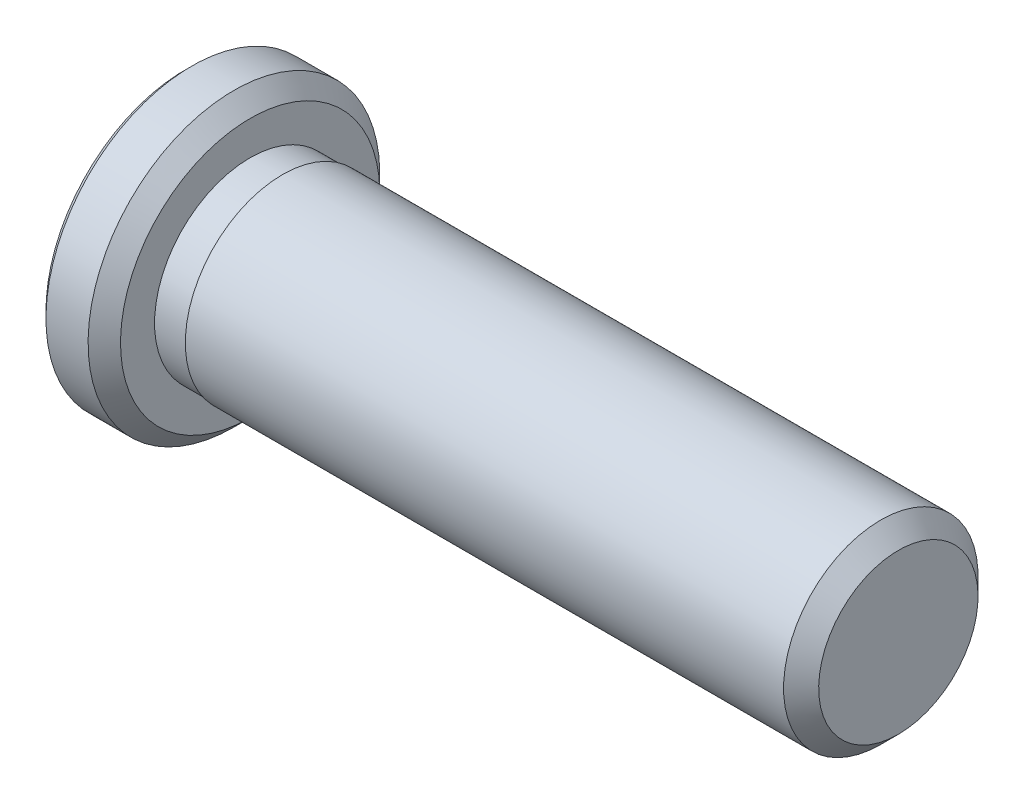
ISO-10303-21;
HEADER;
FILE_DESCRIPTION(('STEP AP214'),'2;1');
FILE_NAME('part.step','',(''),(''),'','','');
FILE_SCHEMA(('AUTOMOTIVE_DESIGN { 1 0 10303 214 1 1 1 1 }'));
ENDSEC;
DATA;
#1=APPLICATION_CONTEXT('core data for automotive mechanical design processes');
#2=APPLICATION_PROTOCOL_DEFINITION('international standard','automotive_design',2000,#1);
#3=PRODUCT_CONTEXT('',#1,'mechanical');
#4=PRODUCT('Part','Part','',(#3));
#5=PRODUCT_RELATED_PRODUCT_CATEGORY('part','',(#4));
#6=PRODUCT_DEFINITION_FORMATION('','',#4);
#7=PRODUCT_DEFINITION_CONTEXT('part definition',#1,'design');
#8=PRODUCT_DEFINITION('design','',#6,#7);
#9=PRODUCT_DEFINITION_SHAPE('','',#8);
#10=(LENGTH_UNIT() NAMED_UNIT(*) SI_UNIT(.MILLI.,.METRE.));
#11=(NAMED_UNIT(*) PLANE_ANGLE_UNIT() SI_UNIT($,.RADIAN.));
#12=(NAMED_UNIT(*) SI_UNIT($,.STERADIAN.) SOLID_ANGLE_UNIT());
#13=UNCERTAINTY_MEASURE_WITH_UNIT(LENGTH_MEASURE(1.E-05),#10,'distance_accuracy_value','');
#14=(GEOMETRIC_REPRESENTATION_CONTEXT(3) GLOBAL_UNCERTAINTY_ASSIGNED_CONTEXT((#13)) GLOBAL_UNIT_ASSIGNED_CONTEXT((#10,
#11,#12)) REPRESENTATION_CONTEXT('',''));
#15=CARTESIAN_POINT('',(0.,0.,0.));
#16=DIRECTION('',(0.,0.,1.));
#17=DIRECTION('',(1.,0.,0.));
#18=AXIS2_PLACEMENT_3D('',#15,#16,#17);
#19=CARTESIAN_POINT('',(-2.,0.,0.));
#20=DIRECTION('',(1.,0.,0.));
#21=DIRECTION('',(0.,1.,0.));
#22=AXIS2_PLACEMENT_3D('',#19,#20,#21);
#23=PLANE('',#22);
#24=DIRECTION('',(0.,0.,1.));
#25=VECTOR('',#24,1.);
#26=CARTESIAN_POINT('',(-2.,-1.5,-0.86602540378444));
#27=LINE('',#26,#25);
#28=CARTESIAN_POINT('',(-2.,-1.5,-0.86602540378444));
#29=VERTEX_POINT('',#28);
#30=CARTESIAN_POINT('',(-2.,-1.5,0.86602540378444));
#31=VERTEX_POINT('',#30);
#32=EDGE_CURVE('E105',#29,#31,#27,.T.);
#33=ORIENTED_EDGE('',*,*,#32,.F.);
#34=DIRECTION('',(0.,-0.866025403784433,0.500000000000009));
#35=VECTOR('',#34,1.);
#36=CARTESIAN_POINT('',(-2.,0.,-1.7320508075689));
#37=LINE('',#36,#35);
#38=CARTESIAN_POINT('',(-2.,0.,-1.7320508075689));
#39=VERTEX_POINT('',#38);
#40=EDGE_CURVE('E31',#39,#29,#37,.T.);
#41=ORIENTED_EDGE('',*,*,#40,.F.);
#42=DIRECTION('',(0.,-0.866025403784433,-0.500000000000009));
#43=VECTOR('',#42,1.);
#44=CARTESIAN_POINT('',(-2.,1.5,-0.86602540378444));
#45=LINE('',#44,#43);
#46=CARTESIAN_POINT('',(-2.,1.5,-0.86602540378444));
#47=VERTEX_POINT('',#46);
#48=EDGE_CURVE('E114',#47,#39,#45,.T.);
#49=ORIENTED_EDGE('',*,*,#48,.F.);
#50=DIRECTION('',(0.,0.,-1.));
#51=VECTOR('',#50,1.);
#52=CARTESIAN_POINT('',(-2.,1.5,0.86602540378444));
#53=LINE('',#52,#51);
#54=CARTESIAN_POINT('',(-2.,1.5,0.86602540378444));
#55=VERTEX_POINT('',#54);
#56=EDGE_CURVE('E112',#55,#47,#53,.T.);
#57=ORIENTED_EDGE('',*,*,#56,.F.);
#58=DIRECTION('',(0.,0.866025403784433,-0.500000000000009));
#59=VECTOR('',#58,1.);
#60=CARTESIAN_POINT('',(-2.,0.,1.7320508075689));
#61=LINE('',#60,#59);
#62=CARTESIAN_POINT('',(-2.,0.,1.7320508075689));
#63=VERTEX_POINT('',#62);
#64=EDGE_CURVE('E79',#63,#55,#61,.T.);
#65=ORIENTED_EDGE('',*,*,#64,.F.);
#66=DIRECTION('',(0.,0.866025403784433,0.500000000000009));
#67=VECTOR('',#66,1.);
#68=CARTESIAN_POINT('',(-2.,-1.5,0.86602540378444));
#69=LINE('',#68,#67);
#70=EDGE_CURVE('E108',#31,#63,#69,.T.);
#71=ORIENTED_EDGE('',*,*,#70,.F.);
#72=EDGE_LOOP('',(#33,#41,#49,#57,#65,#71));
#73=FACE_BOUND('',#72,.T.);
#74=CARTESIAN_POINT('',(-2.,0.,0.));
#75=DIRECTION('',(-1.,0.,0.));
#76=DIRECTION('',(0.,-1.,0.));
#77=AXIS2_PLACEMENT_3D('',#74,#75,#76);
#78=CIRCLE('',#77,4.3);
#79=CARTESIAN_POINT('',(-2.,-4.3,0.));
#80=VERTEX_POINT('',#79);
#81=EDGE_CURVE('E11',#80,#80,#78,.T.);
#82=ORIENTED_EDGE('',*,*,#81,.T.);
#83=EDGE_LOOP('',(#82));
#84=FACE_BOUND('',#83,.T.);
#85=ADVANCED_FACE('F17',(#73,#84),#23,.F.);
#86=CARTESIAN_POINT('',(-1.8,0.,0.));
#87=DIRECTION('',(1.,0.,0.));
#88=DIRECTION('',(0.,1.,0.));
#89=AXIS2_PLACEMENT_3D('',#86,#87,#88);
#90=CONICAL_SURFACE('',#89,4.5,0.78539816339745);
#91=ORIENTED_EDGE('',*,*,#81,.F.);
#92=EDGE_LOOP('',(#91));
#93=FACE_BOUND('',#92,.T.);
#94=CARTESIAN_POINT('',(-1.8,0.,0.));
#95=DIRECTION('',(-1.,0.,0.));
#96=DIRECTION('',(0.,-1.,0.));
#97=AXIS2_PLACEMENT_3D('',#94,#95,#96);
#98=CIRCLE('',#97,4.5);
#99=CARTESIAN_POINT('',(-1.8,-4.5,0.));
#100=VERTEX_POINT('',#99);
#101=EDGE_CURVE('E24',#100,#100,#98,.T.);
#102=ORIENTED_EDGE('',*,*,#101,.T.);
#103=EDGE_LOOP('',(#102));
#104=FACE_BOUND('',#103,.T.);
#105=ADVANCED_FACE('F146',(#93,#104),#90,.T.);
#106=CARTESIAN_POINT('',(20.,0.,0.));
#107=DIRECTION('',(-1.,0.,0.));
#108=DIRECTION('',(0.,-1.,0.));
#109=AXIS2_PLACEMENT_3D('',#106,#107,#108);
#110=CYLINDRICAL_SURFACE('',#109,4.5);
#111=ORIENTED_EDGE('',*,*,#101,.F.);
#112=EDGE_LOOP('',(#111));
#113=FACE_BOUND('',#112,.T.);
#114=CARTESIAN_POINT('',(-0.5,0.,0.));
#115=DIRECTION('',(-1.,0.,0.));
#116=DIRECTION('',(0.,-1.,0.));
#117=AXIS2_PLACEMENT_3D('',#114,#115,#116);
#118=CIRCLE('',#117,4.5);
#119=CARTESIAN_POINT('',(-0.5,-4.5,0.));
#120=VERTEX_POINT('',#119);
#121=EDGE_CURVE('E141',#120,#120,#118,.T.);
#122=ORIENTED_EDGE('',*,*,#121,.T.);
#123=EDGE_LOOP('',(#122));
#124=FACE_BOUND('',#123,.T.);
#125=ADVANCED_FACE('F148',(#113,#124),#110,.T.);
#126=CARTESIAN_POINT('',(0.,0.,0.));
#127=DIRECTION('',(-1.,0.,0.));
#128=DIRECTION('',(0.,-1.,0.));
#129=AXIS2_PLACEMENT_3D('',#126,#127,#128);
#130=CONICAL_SURFACE('',#129,4.,0.785398163397448);
#131=ORIENTED_EDGE('',*,*,#121,.F.);
#132=EDGE_LOOP('',(#131));
#133=FACE_BOUND('',#132,.T.);
#134=CARTESIAN_POINT('',(0.,0.,0.));
#135=DIRECTION('',(-1.,0.,0.));
#136=DIRECTION('',(0.,-1.,0.));
#137=AXIS2_PLACEMENT_3D('',#134,#135,#136);
#138=CIRCLE('',#137,4.);
#139=CARTESIAN_POINT('',(0.,-4.,0.));
#140=VERTEX_POINT('',#139);
#141=EDGE_CURVE('E138',#140,#140,#138,.T.);
#142=ORIENTED_EDGE('',*,*,#141,.T.);
#143=EDGE_LOOP('',(#142));
#144=FACE_BOUND('',#143,.T.);
#145=ADVANCED_FACE('F151',(#133,#144),#130,.T.);
#146=CARTESIAN_POINT('',(0.,4.,0.));
#147=DIRECTION('',(-1.,0.,0.));
#148=DIRECTION('',(0.,-1.,0.));
#149=AXIS2_PLACEMENT_3D('',#146,#147,#148);
#150=PLANE('',#149);
#151=ORIENTED_EDGE('',*,*,#141,.F.);
#152=EDGE_LOOP('',(#151));
#153=FACE_BOUND('',#152,.T.);
#154=CARTESIAN_POINT('',(0.,0.,0.));
#155=DIRECTION('',(-1.,0.,0.));
#156=DIRECTION('',(0.,-1.,0.));
#157=AXIS2_PLACEMENT_3D('',#154,#155,#156);
#158=CIRCLE('',#157,2.95);
#159=CARTESIAN_POINT('',(0.,-2.95,0.));
#160=VERTEX_POINT('',#159);
#161=EDGE_CURVE('E135',#160,#160,#158,.T.);
#162=ORIENTED_EDGE('',*,*,#161,.T.);
#163=EDGE_LOOP('',(#162));
#164=FACE_BOUND('',#163,.T.);
#165=ADVANCED_FACE('F157',(#153,#164),#150,.F.);
#166=CARTESIAN_POINT('',(20.,0.,0.));
#167=DIRECTION('',(-1.,0.,0.));
#168=DIRECTION('',(0.,-1.,0.));
#169=AXIS2_PLACEMENT_3D('',#166,#167,#168);
#170=CYLINDRICAL_SURFACE('',#169,2.95);
#171=ORIENTED_EDGE('',*,*,#161,.F.);
#172=EDGE_LOOP('',(#171));
#173=FACE_BOUND('',#172,.T.);
#174=CARTESIAN_POINT('',(1.,0.,0.));
#175=DIRECTION('',(-1.,0.,0.));
#176=DIRECTION('',(0.,-1.,0.));
#177=AXIS2_PLACEMENT_3D('',#174,#175,#176);
#178=CIRCLE('',#177,2.95);
#179=CARTESIAN_POINT('',(1.,-2.95,0.));
#180=VERTEX_POINT('',#179);
#181=EDGE_CURVE('E132',#180,#180,#178,.T.);
#182=ORIENTED_EDGE('',*,*,#181,.T.);
#183=EDGE_LOOP('',(#182));
#184=FACE_BOUND('',#183,.T.);
#185=ADVANCED_FACE('F163',(#173,#184),#170,.T.);
#186=CARTESIAN_POINT('',(1.,2.95,0.));
#187=DIRECTION('',(1.,0.,0.));
#188=DIRECTION('',(0.,1.,0.));
#189=AXIS2_PLACEMENT_3D('',#186,#187,#188);
#190=PLANE('',#189);
#191=ORIENTED_EDGE('',*,*,#181,.F.);
#192=EDGE_LOOP('',(#191));
#193=FACE_BOUND('',#192,.T.);
#194=CARTESIAN_POINT('',(1.,0.,0.));
#195=DIRECTION('',(-1.,0.,0.));
#196=DIRECTION('',(0.,-1.,0.));
#197=AXIS2_PLACEMENT_3D('',#194,#195,#196);
#198=CIRCLE('',#197,3.);
#199=CARTESIAN_POINT('',(1.,-3.,0.));
#200=VERTEX_POINT('',#199);
#201=EDGE_CURVE('E129',#200,#200,#198,.T.);
#202=ORIENTED_EDGE('',*,*,#201,.T.);
#203=EDGE_LOOP('',(#202));
#204=FACE_BOUND('',#203,.T.);
#205=ADVANCED_FACE('F169',(#193,#204),#190,.F.);
#206=CARTESIAN_POINT('',(20.,0.,0.));
#207=DIRECTION('',(-1.,0.,0.));
#208=DIRECTION('',(0.,-1.,0.));
#209=AXIS2_PLACEMENT_3D('',#206,#207,#208);
#210=CYLINDRICAL_SURFACE('',#209,3.);
#211=ORIENTED_EDGE('',*,*,#201,.F.);
#212=EDGE_LOOP('',(#211));
#213=FACE_BOUND('',#212,.T.);
#214=CARTESIAN_POINT('',(19.4585,0.,0.));
#215=DIRECTION('',(-1.,0.,0.));
#216=DIRECTION('',(0.,-1.,0.));
#217=AXIS2_PLACEMENT_3D('',#214,#215,#216);
#218=CIRCLE('',#217,3.);
#219=CARTESIAN_POINT('',(19.4585,-3.,0.));
#220=VERTEX_POINT('',#219);
#221=EDGE_CURVE('E126',#220,#220,#218,.T.);
#222=ORIENTED_EDGE('',*,*,#221,.T.);
#223=EDGE_LOOP('',(#222));
#224=FACE_BOUND('',#223,.T.);
#225=ADVANCED_FACE('F175',(#213,#224),#210,.T.);
#226=CARTESIAN_POINT('',(20.,0.,0.));
#227=DIRECTION('',(-1.,0.,0.));
#228=DIRECTION('',(0.,-1.,0.));
#229=AXIS2_PLACEMENT_3D('',#226,#227,#228);
#230=CONICAL_SURFACE('',#229,2.4585,0.785398163397448);
#231=ORIENTED_EDGE('',*,*,#221,.F.);
#232=EDGE_LOOP('',(#231));
#233=FACE_BOUND('',#232,.T.);
#234=CARTESIAN_POINT('',(20.,0.,0.));
#235=DIRECTION('',(-1.,0.,0.));
#236=DIRECTION('',(0.,-1.,0.));
#237=AXIS2_PLACEMENT_3D('',#234,#235,#236);
#238=CIRCLE('',#237,2.4585);
#239=CARTESIAN_POINT('',(20.,-2.4585,0.));
#240=VERTEX_POINT('',#239);
#241=EDGE_CURVE('E118',#240,#240,#238,.T.);
#242=ORIENTED_EDGE('',*,*,#241,.T.);
#243=EDGE_LOOP('',(#242));
#244=FACE_BOUND('',#243,.T.);
#245=ADVANCED_FACE('F181',(#233,#244),#230,.T.);
#246=CARTESIAN_POINT('',(20.,2.4585,0.));
#247=DIRECTION('',(-1.,0.,0.));
#248=DIRECTION('',(0.,-1.,0.));
#249=AXIS2_PLACEMENT_3D('',#246,#247,#248);
#250=PLANE('',#249);
#251=ORIENTED_EDGE('',*,*,#241,.F.);
#252=EDGE_LOOP('',(#251));
#253=FACE_BOUND('',#252,.T.);
#254=ADVANCED_FACE('F187',(#253),#250,.F.);
#255=CARTESIAN_POINT('',(-0.6,0.,-1.7320508075689));
#256=DIRECTION('',(0.,-0.500000000000009,-0.866025403784433));
#257=DIRECTION('',(0.,0.866025403784433,-0.500000000000009));
#258=AXIS2_PLACEMENT_3D('',#255,#256,#257);
#259=PLANE('',#258);
#260=ORIENTED_EDGE('',*,*,#40,.T.);
#261=DIRECTION('',(-1.,0.,0.));
#262=VECTOR('',#261,1.);
#263=CARTESIAN_POINT('',(-0.6,-1.5,-0.86602540378444));
#264=LINE('',#263,#262);
#265=CARTESIAN_POINT('',(-0.6,-1.5,-0.86602540378444));
#266=VERTEX_POINT('',#265);
#267=EDGE_CURVE('E61',#266,#29,#264,.T.);
#268=ORIENTED_EDGE('',*,*,#267,.F.);
#269=DIRECTION('',(0.,-0.866025403784433,0.500000000000009));
#270=VECTOR('',#269,1.);
#271=CARTESIAN_POINT('',(-0.6,0.,-1.7320508075689));
#272=LINE('',#271,#270);
#273=CARTESIAN_POINT('',(-0.6,0.,-1.7320508075689));
#274=VERTEX_POINT('',#273);
#275=EDGE_CURVE('E116',#274,#266,#272,.T.);
#276=ORIENTED_EDGE('',*,*,#275,.F.);
#277=DIRECTION('',(-1.,0.,0.));
#278=VECTOR('',#277,1.);
#279=CARTESIAN_POINT('',(-0.6,0.,-1.7320508075689));
#280=LINE('',#279,#278);
#281=EDGE_CURVE('E39',#274,#39,#280,.T.);
#282=ORIENTED_EDGE('',*,*,#281,.T.);
#283=EDGE_LOOP('',(#260,#268,#276,#282));
#284=FACE_BOUND('',#283,.T.);
#285=ADVANCED_FACE('F192',(#284),#259,.F.);
#286=CARTESIAN_POINT('',(-0.6,1.5,-0.86602540378444));
#287=DIRECTION('',(0.,0.500000000000009,-0.866025403784433));
#288=DIRECTION('',(0.,0.866025403784433,0.500000000000009));
#289=AXIS2_PLACEMENT_3D('',#286,#287,#288);
#290=PLANE('',#289);
#291=ORIENTED_EDGE('',*,*,#48,.T.);
#292=ORIENTED_EDGE('',*,*,#281,.F.);
#293=DIRECTION('',(0.,-0.866025403784433,-0.500000000000009));
#294=VECTOR('',#293,1.);
#295=CARTESIAN_POINT('',(-0.6,1.5,-0.86602540378444));
#296=LINE('',#295,#294);
#297=CARTESIAN_POINT('',(-0.6,1.5,-0.86602540378444));
#298=VERTEX_POINT('',#297);
#299=EDGE_CURVE('E91',#298,#274,#296,.T.);
#300=ORIENTED_EDGE('',*,*,#299,.F.);
#301=DIRECTION('',(-1.,0.,0.));
#302=VECTOR('',#301,1.);
#303=CARTESIAN_POINT('',(-0.6,1.5,-0.86602540378444));
#304=LINE('',#303,#302);
#305=EDGE_CURVE('E83',#298,#47,#304,.T.);
#306=ORIENTED_EDGE('',*,*,#305,.T.);
#307=EDGE_LOOP('',(#291,#292,#300,#306));
#308=FACE_BOUND('',#307,.T.);
#309=ADVANCED_FACE('F199',(#308),#290,.F.);
#310=CARTESIAN_POINT('',(-0.6,1.5,0.86602540378444));
#311=DIRECTION('',(0.,1.,0.));
#312=DIRECTION('',(0.,0.,1.));
#313=AXIS2_PLACEMENT_3D('',#310,#311,#312);
#314=PLANE('',#313);
#315=ORIENTED_EDGE('',*,*,#56,.T.);
#316=ORIENTED_EDGE('',*,*,#305,.F.);
#317=DIRECTION('',(0.,0.,-1.));
#318=VECTOR('',#317,1.);
#319=CARTESIAN_POINT('',(-0.6,1.5,0.86602540378444));
#320=LINE('',#319,#318);
#321=CARTESIAN_POINT('',(-0.6,1.5,0.86602540378444));
#322=VERTEX_POINT('',#321);
#323=EDGE_CURVE('E87',#322,#298,#320,.T.);
#324=ORIENTED_EDGE('',*,*,#323,.F.);
#325=DIRECTION('',(-1.,0.,0.));
#326=VECTOR('',#325,1.);
#327=CARTESIAN_POINT('',(-0.6,1.5,0.86602540378444));
#328=LINE('',#327,#326);
#329=EDGE_CURVE('E72',#322,#55,#328,.T.);
#330=ORIENTED_EDGE('',*,*,#329,.T.);
#331=EDGE_LOOP('',(#315,#316,#324,#330));
#332=FACE_BOUND('',#331,.T.);
#333=ADVANCED_FACE('F88',(#332),#314,.F.);
#334=CARTESIAN_POINT('',(-0.6,0.,1.7320508075689));
#335=DIRECTION('',(0.,0.500000000000009,0.866025403784433));
#336=DIRECTION('',(0.,-0.866025403784433,0.500000000000009));
#337=AXIS2_PLACEMENT_3D('',#334,#335,#336);
#338=PLANE('',#337);
#339=ORIENTED_EDGE('',*,*,#64,.T.);
#340=ORIENTED_EDGE('',*,*,#329,.F.);
#341=DIRECTION('',(0.,0.866025403784433,-0.500000000000009));
#342=VECTOR('',#341,1.);
#343=CARTESIAN_POINT('',(-0.6,0.,1.7320508075689));
#344=LINE('',#343,#342);
#345=CARTESIAN_POINT('',(-0.6,0.,1.7320508075689));
#346=VERTEX_POINT('',#345);
#347=EDGE_CURVE('E76',#346,#322,#344,.T.);
#348=ORIENTED_EDGE('',*,*,#347,.F.);
#349=DIRECTION('',(-1.,0.,0.));
#350=VECTOR('',#349,1.);
#351=CARTESIAN_POINT('',(-0.6,0.,1.7320508075689));
#352=LINE('',#351,#350);
#353=EDGE_CURVE('E84',#346,#63,#352,.T.);
#354=ORIENTED_EDGE('',*,*,#353,.T.);
#355=EDGE_LOOP('',(#339,#340,#348,#354));
#356=FACE_BOUND('',#355,.T.);
#357=ADVANCED_FACE('F74',(#356),#338,.F.);
#358=CARTESIAN_POINT('',(-0.6,-1.5,0.86602540378444));
#359=DIRECTION('',(0.,-0.500000000000009,0.866025403784433));
#360=DIRECTION('',(0.,-0.866025403784433,-0.500000000000009));
#361=AXIS2_PLACEMENT_3D('',#358,#359,#360);
#362=PLANE('',#361);
#363=ORIENTED_EDGE('',*,*,#70,.T.);
#364=ORIENTED_EDGE('',*,*,#353,.F.);
#365=DIRECTION('',(0.,0.866025403784433,0.500000000000009));
#366=VECTOR('',#365,1.);
#367=CARTESIAN_POINT('',(-0.6,-1.5,0.86602540378444));
#368=LINE('',#367,#366);
#369=CARTESIAN_POINT('',(-0.6,-1.5,0.86602540378444));
#370=VERTEX_POINT('',#369);
#371=EDGE_CURVE('E97',#370,#346,#368,.T.);
#372=ORIENTED_EDGE('',*,*,#371,.F.);
#373=DIRECTION('',(-1.,0.,0.));
#374=VECTOR('',#373,1.);
#375=CARTESIAN_POINT('',(-0.6,-1.5,0.86602540378444));
#376=LINE('',#375,#374);
#377=EDGE_CURVE('E121',#370,#31,#376,.T.);
#378=ORIENTED_EDGE('',*,*,#377,.T.);
#379=EDGE_LOOP('',(#363,#364,#372,#378));
#380=FACE_BOUND('',#379,.T.);
#381=ADVANCED_FACE('F227',(#380),#362,.F.);
#382=CARTESIAN_POINT('',(-0.6,-1.5,-0.86602540378444));
#383=DIRECTION('',(0.,-1.,0.));
#384=DIRECTION('',(0.,0.,-1.));
#385=AXIS2_PLACEMENT_3D('',#382,#383,#384);
#386=PLANE('',#385);
#387=ORIENTED_EDGE('',*,*,#32,.T.);
#388=ORIENTED_EDGE('',*,*,#377,.F.);
#389=DIRECTION('',(0.,0.,1.));
#390=VECTOR('',#389,1.);
#391=CARTESIAN_POINT('',(-0.6,-1.5,-0.86602540378444));
#392=LINE('',#391,#390);
#393=EDGE_CURVE('E99',#266,#370,#392,.T.);
#394=ORIENTED_EDGE('',*,*,#393,.F.);
#395=ORIENTED_EDGE('',*,*,#267,.T.);
#396=EDGE_LOOP('',(#387,#388,#394,#395));
#397=FACE_BOUND('',#396,.T.);
#398=ADVANCED_FACE('F214',(#397),#386,.F.);
#399=CARTESIAN_POINT('',(-0.6,-1.5,-0.86602540378444));
#400=DIRECTION('',(-1.,0.,0.));
#401=DIRECTION('',(0.,0.,1.));
#402=AXIS2_PLACEMENT_3D('',#399,#400,#401);
#403=PLANE('',#402);
#404=ORIENTED_EDGE('',*,*,#275,.T.);
#405=ORIENTED_EDGE('',*,*,#393,.T.);
#406=ORIENTED_EDGE('',*,*,#371,.T.);
#407=ORIENTED_EDGE('',*,*,#347,.T.);
#408=ORIENTED_EDGE('',*,*,#323,.T.);
#409=ORIENTED_EDGE('',*,*,#299,.T.);
#410=EDGE_LOOP('',(#404,#405,#406,#407,#408,#409));
#411=FACE_BOUND('',#410,.T.);
#412=ADVANCED_FACE('F94',(#411),#403,.T.);
#413=CLOSED_SHELL('',(#85,#105,#125,#145,#165,#185,#205,#225,#245,#254,#285,#309,#333,#357,#381,
#398,#412));
#414=MANIFOLD_SOLID_BREP('B1',#413);
#415=ADVANCED_BREP_SHAPE_REPRESENTATION('',(#18,#414),#14);
#416=SHAPE_DEFINITION_REPRESENTATION(#9,#415);
ENDSEC;
END-ISO-10303-21;
